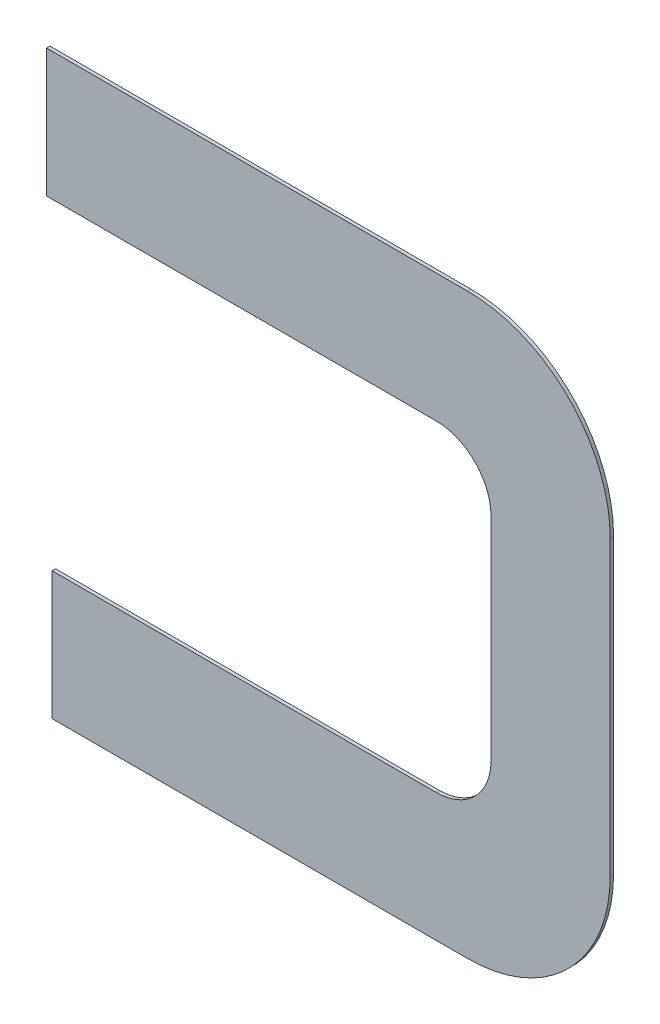
ISO-10303-21;
HEADER;
FILE_DESCRIPTION(('STEP AP214'),'2;1');
FILE_NAME('part.step','',(''),(''),'','','');
FILE_SCHEMA(('AUTOMOTIVE_DESIGN { 1 0 10303 214 1 1 1 1 }'));
ENDSEC;
DATA;
#1=APPLICATION_CONTEXT('core data for automotive mechanical design processes');
#2=APPLICATION_PROTOCOL_DEFINITION('international standard','automotive_design',2000,#1);
#3=PRODUCT_CONTEXT('',#1,'mechanical');
#4=PRODUCT('Part','Part','',(#3));
#5=PRODUCT_RELATED_PRODUCT_CATEGORY('part','',(#4));
#6=PRODUCT_DEFINITION_FORMATION('','',#4);
#7=PRODUCT_DEFINITION_CONTEXT('part definition',#1,'design');
#8=PRODUCT_DEFINITION('design','',#6,#7);
#9=PRODUCT_DEFINITION_SHAPE('','',#8);
#10=(LENGTH_UNIT() NAMED_UNIT(*) SI_UNIT(.MILLI.,.METRE.));
#11=(NAMED_UNIT(*) PLANE_ANGLE_UNIT() SI_UNIT($,.RADIAN.));
#12=(NAMED_UNIT(*) SI_UNIT($,.STERADIAN.) SOLID_ANGLE_UNIT());
#13=UNCERTAINTY_MEASURE_WITH_UNIT(LENGTH_MEASURE(1.E-05),#10,'distance_accuracy_value','');
#14=(GEOMETRIC_REPRESENTATION_CONTEXT(3) GLOBAL_UNCERTAINTY_ASSIGNED_CONTEXT((#13)) GLOBAL_UNIT_ASSIGNED_CONTEXT((#10,
#11,#12)) REPRESENTATION_CONTEXT('',''));
#15=CARTESIAN_POINT('',(0.,0.,0.));
#16=DIRECTION('',(0.,0.,1.));
#17=DIRECTION('',(1.,0.,0.));
#18=AXIS2_PLACEMENT_3D('',#15,#16,#17);
#19=CARTESIAN_POINT('',(2.205976284568,-14.65384962898,0.01));
#20=DIRECTION('',(0.,0.,1.));
#21=DIRECTION('',(1.,0.,0.));
#22=AXIS2_PLACEMENT_3D('',#19,#20,#21);
#23=PLANE('',#22);
#24=DIRECTION('',(-1.,0.,0.));
#25=VECTOR('',#24,1.);
#26=CARTESIAN_POINT('',(2.573938571429,-15.51474593191,0.01));
#27=LINE('',#26,#25);
#28=CARTESIAN_POINT('',(2.573938571429,-15.51474593191,0.01));
#29=VERTEX_POINT('',#28);
#30=CARTESIAN_POINT('',(1.340184000007,-15.51474593191,0.01));
#31=VERTEX_POINT('',#30);
#32=EDGE_CURVE('E435',#29,#31,#27,.T.);
#33=ORIENTED_EDGE('',*,*,#32,.F.);
#34=CARTESIAN_POINT('',(2.573938571429,-15.09141732865,0.01));
#35=DIRECTION('',(0.,0.,1.));
#36=DIRECTION('',(1.,0.,0.));
#37=AXIS2_PLACEMENT_3D('',#34,#35,#36);
#38=CIRCLE('',#37,0.423328603261);
#39=CARTESIAN_POINT('',(2.99726717469,-15.09141732865,0.01));
#40=VERTEX_POINT('',#39);
#41=EDGE_CURVE('E11',#29,#40,#38,.T.);
#42=ORIENTED_EDGE('',*,*,#41,.T.);
#43=DIRECTION('',(0.,-1.,0.));
#44=VECTOR('',#43,1.);
#45=CARTESIAN_POINT('',(2.99726717469,-14.22144689234,0.01));
#46=LINE('',#45,#44);
#47=CARTESIAN_POINT('',(2.99726717469,-14.22144689234,0.01));
#48=VERTEX_POINT('',#47);
#49=EDGE_CURVE('E165',#48,#40,#46,.T.);
#50=ORIENTED_EDGE('',*,*,#49,.F.);
#51=CARTESIAN_POINT('',(2.573938571429,-14.22144689234,0.01));
#52=DIRECTION('',(0.,0.,1.));
#53=DIRECTION('',(1.,0.,0.));
#54=AXIS2_PLACEMENT_3D('',#51,#52,#53);
#55=CIRCLE('',#54,0.423328603261);
#56=CARTESIAN_POINT('',(2.573938571429,-13.79811828908,0.01));
#57=VERTEX_POINT('',#56);
#58=EDGE_CURVE('E153',#48,#57,#55,.T.);
#59=ORIENTED_EDGE('',*,*,#58,.T.);
#60=DIRECTION('',(1.,0.,0.));
#61=VECTOR('',#60,1.);
#62=CARTESIAN_POINT('',(1.323052,-13.79811828908,0.01));
#63=LINE('',#62,#61);
#64=CARTESIAN_POINT('',(1.323052,-13.79811828908,0.01));
#65=VERTEX_POINT('',#64);
#66=EDGE_CURVE('E314',#65,#57,#63,.T.);
#67=ORIENTED_EDGE('',*,*,#66,.F.);
#68=DIRECTION('',(0.,1.,0.));
#69=VECTOR('',#68,1.);
#70=CARTESIAN_POINT('',(1.323052,-14.17865458836,0.01));
#71=LINE('',#70,#69);
#72=CARTESIAN_POINT('',(1.323052,-14.17865458836,0.01));
#73=VERTEX_POINT('',#72);
#74=EDGE_CURVE('E317',#73,#65,#71,.T.);
#75=ORIENTED_EDGE('',*,*,#74,.F.);
#76=DIRECTION('',(-1.,0.,0.));
#77=VECTOR('',#76,1.);
#78=CARTESIAN_POINT('',(2.480024778252,-14.17865458836,0.01));
#79=LINE('',#78,#77);
#80=CARTESIAN_POINT('',(2.480024778252,-14.17865458836,0.01));
#81=VERTEX_POINT('',#80);
#82=EDGE_CURVE('E359',#81,#73,#79,.T.);
#83=ORIENTED_EDGE('',*,*,#82,.F.);
#84=CARTESIAN_POINT('',(2.480024778252,-14.34205856215,0.01));
#85=DIRECTION('',(0.,0.,1.));
#86=DIRECTION('',(1.,0.,0.));
#87=AXIS2_PLACEMENT_3D('',#84,#85,#86);
#88=CIRCLE('',#87,0.16340397379);
#89=CARTESIAN_POINT('',(2.643428752042,-14.34205856215,0.01));
#90=VERTEX_POINT('',#89);
#91=EDGE_CURVE('E349',#90,#81,#88,.T.);
#92=ORIENTED_EDGE('',*,*,#91,.F.);
#93=DIRECTION('',(0.,1.,0.));
#94=VECTOR('',#93,1.);
#95=CARTESIAN_POINT('',(2.643428752042,-14.97080565884,0.01));
#96=LINE('',#95,#94);
#97=CARTESIAN_POINT('',(2.643428752042,-14.97080565884,0.01));
#98=VERTEX_POINT('',#97);
#99=EDGE_CURVE('E334',#98,#90,#96,.T.);
#100=ORIENTED_EDGE('',*,*,#99,.F.);
#101=CARTESIAN_POINT('',(2.480024778252,-14.97080565884,0.01));
#102=DIRECTION('',(0.,0.,1.));
#103=DIRECTION('',(1.,0.,0.));
#104=AXIS2_PLACEMENT_3D('',#101,#102,#103);
#105=CIRCLE('',#104,0.16340397379);
#106=CARTESIAN_POINT('',(2.480024778252,-15.13420963263,0.01));
#107=VERTEX_POINT('',#106);
#108=EDGE_CURVE('E344',#107,#98,#105,.T.);
#109=ORIENTED_EDGE('',*,*,#108,.F.);
#110=DIRECTION('',(1.,0.,0.));
#111=VECTOR('',#110,1.);
#112=CARTESIAN_POINT('',(1.340184000007,-15.13420963263,0.01));
#113=LINE('',#112,#111);
#114=CARTESIAN_POINT('',(1.340184000007,-15.13420963263,0.01));
#115=VERTEX_POINT('',#114);
#116=EDGE_CURVE('E394',#115,#107,#113,.T.);
#117=ORIENTED_EDGE('',*,*,#116,.F.);
#118=DIRECTION('',(0.,1.,0.));
#119=VECTOR('',#118,1.);
#120=CARTESIAN_POINT('',(1.340184000007,-15.51474593191,0.01));
#121=LINE('',#120,#119);
#122=EDGE_CURVE('E409',#31,#115,#121,.T.);
#123=ORIENTED_EDGE('',*,*,#122,.F.);
#124=EDGE_LOOP('',(#33,#42,#50,#59,#67,#75,#83,#92,#100,#109,#117,#123));
#125=FACE_BOUND('',#124,.T.);
#126=ADVANCED_FACE('F17',(#125),#23,.T.);
#127=CARTESIAN_POINT('',(2.205976284568,-14.65384962898,0.));
#128=DIRECTION('',(0.,0.,1.));
#129=DIRECTION('',(1.,0.,0.));
#130=AXIS2_PLACEMENT_3D('',#127,#128,#129);
#131=PLANE('',#130);
#132=DIRECTION('',(-1.,0.,0.));
#133=VECTOR('',#132,1.);
#134=CARTESIAN_POINT('',(2.573938571429,-15.51474593191,0.));
#135=LINE('',#134,#133);
#136=CARTESIAN_POINT('',(2.573938571429,-15.51474593191,0.));
#137=VERTEX_POINT('',#136);
#138=CARTESIAN_POINT('',(1.340184000007,-15.51474593191,0.));
#139=VERTEX_POINT('',#138);
#140=EDGE_CURVE('E416',#137,#139,#135,.T.);
#141=ORIENTED_EDGE('',*,*,#140,.T.);
#142=DIRECTION('',(0.,1.,0.));
#143=VECTOR('',#142,1.);
#144=CARTESIAN_POINT('',(1.340184000007,-15.51474593191,0.));
#145=LINE('',#144,#143);
#146=CARTESIAN_POINT('',(1.340184000007,-15.13420963263,0.));
#147=VERTEX_POINT('',#146);
#148=EDGE_CURVE('E398',#139,#147,#145,.T.);
#149=ORIENTED_EDGE('',*,*,#148,.T.);
#150=DIRECTION('',(1.,0.,0.));
#151=VECTOR('',#150,1.);
#152=CARTESIAN_POINT('',(1.340184000007,-15.13420963263,0.));
#153=LINE('',#152,#151);
#154=CARTESIAN_POINT('',(2.480024778252,-15.13420963263,0.));
#155=VERTEX_POINT('',#154);
#156=EDGE_CURVE('E340',#147,#155,#153,.T.);
#157=ORIENTED_EDGE('',*,*,#156,.T.);
#158=CARTESIAN_POINT('',(2.480024778252,-14.97080565884,0.));
#159=DIRECTION('',(0.,0.,1.));
#160=DIRECTION('',(1.,0.,0.));
#161=AXIS2_PLACEMENT_3D('',#158,#159,#160);
#162=CIRCLE('',#161,0.16340397379);
#163=CARTESIAN_POINT('',(2.643428752042,-14.97080565884,0.));
#164=VERTEX_POINT('',#163);
#165=EDGE_CURVE('E336',#155,#164,#162,.T.);
#166=ORIENTED_EDGE('',*,*,#165,.T.);
#167=DIRECTION('',(0.,1.,0.));
#168=VECTOR('',#167,1.);
#169=CARTESIAN_POINT('',(2.643428752042,-14.97080565884,0.));
#170=LINE('',#169,#168);
#171=CARTESIAN_POINT('',(2.643428752042,-14.34205856215,0.));
#172=VERTEX_POINT('',#171);
#173=EDGE_CURVE('E354',#164,#172,#170,.T.);
#174=ORIENTED_EDGE('',*,*,#173,.T.);
#175=CARTESIAN_POINT('',(2.480024778252,-14.34205856215,0.));
#176=DIRECTION('',(0.,0.,1.));
#177=DIRECTION('',(1.,0.,0.));
#178=AXIS2_PLACEMENT_3D('',#175,#176,#177);
#179=CIRCLE('',#178,0.16340397379);
#180=CARTESIAN_POINT('',(2.480024778252,-14.17865458836,0.));
#181=VERTEX_POINT('',#180);
#182=EDGE_CURVE('E355',#172,#181,#179,.T.);
#183=ORIENTED_EDGE('',*,*,#182,.T.);
#184=DIRECTION('',(-1.,0.,0.));
#185=VECTOR('',#184,1.);
#186=CARTESIAN_POINT('',(2.480024778252,-14.17865458836,0.));
#187=LINE('',#186,#185);
#188=CARTESIAN_POINT('',(1.323052,-14.17865458836,0.));
#189=VERTEX_POINT('',#188);
#190=EDGE_CURVE('E324',#181,#189,#187,.T.);
#191=ORIENTED_EDGE('',*,*,#190,.T.);
#192=DIRECTION('',(0.,1.,0.));
#193=VECTOR('',#192,1.);
#194=CARTESIAN_POINT('',(1.323052,-14.17865458836,0.));
#195=LINE('',#194,#193);
#196=CARTESIAN_POINT('',(1.323052,-13.79811828908,0.));
#197=VERTEX_POINT('',#196);
#198=EDGE_CURVE('E316',#189,#197,#195,.T.);
#199=ORIENTED_EDGE('',*,*,#198,.T.);
#200=DIRECTION('',(1.,0.,0.));
#201=VECTOR('',#200,1.);
#202=CARTESIAN_POINT('',(1.323052,-13.79811828908,0.));
#203=LINE('',#202,#201);
#204=CARTESIAN_POINT('',(2.573938571429,-13.79811828908,0.));
#205=VERTEX_POINT('',#204);
#206=EDGE_CURVE('E148',#197,#205,#203,.T.);
#207=ORIENTED_EDGE('',*,*,#206,.T.);
#208=CARTESIAN_POINT('',(2.573938571429,-14.22144689234,0.));
#209=DIRECTION('',(0.,0.,1.));
#210=DIRECTION('',(1.,0.,0.));
#211=AXIS2_PLACEMENT_3D('',#208,#209,#210);
#212=CIRCLE('',#211,0.423328603261);
#213=CARTESIAN_POINT('',(2.99726717469,-14.22144689234,0.));
#214=VERTEX_POINT('',#213);
#215=EDGE_CURVE('E144',#214,#205,#212,.T.);
#216=ORIENTED_EDGE('',*,*,#215,.F.);
#217=DIRECTION('',(0.,-1.,0.));
#218=VECTOR('',#217,1.);
#219=CARTESIAN_POINT('',(2.99726717469,-14.22144689234,0.));
#220=LINE('',#219,#218);
#221=CARTESIAN_POINT('',(2.99726717469,-15.09141732865,0.));
#222=VERTEX_POINT('',#221);
#223=EDGE_CURVE('E134',#214,#222,#220,.T.);
#224=ORIENTED_EDGE('',*,*,#223,.T.);
#225=CARTESIAN_POINT('',(2.573938571429,-15.09141732865,0.));
#226=DIRECTION('',(0.,0.,1.));
#227=DIRECTION('',(1.,0.,0.));
#228=AXIS2_PLACEMENT_3D('',#225,#226,#227);
#229=CIRCLE('',#228,0.423328603261);
#230=EDGE_CURVE('E26',#137,#222,#229,.T.);
#231=ORIENTED_EDGE('',*,*,#230,.F.);
#232=EDGE_LOOP('',(#141,#149,#157,#166,#174,#183,#191,#199,#207,#216,#224,#231));
#233=FACE_BOUND('',#232,.T.);
#234=ADVANCED_FACE('F146',(#233),#131,.F.);
#235=CARTESIAN_POINT('',(2.573938571429,-15.09141732865,0.));
#236=DIRECTION('',(0.,0.,-1.));
#237=DIRECTION('',(1.,0.,0.));
#238=AXIS2_PLACEMENT_3D('',#235,#236,#237);
#239=CYLINDRICAL_SURFACE('',#238,0.423328603261);
#240=DIRECTION('',(0.,0.,1.));
#241=VECTOR('',#240,1.);
#242=CARTESIAN_POINT('',(2.573938571429,-15.51474593191,0.));
#243=LINE('',#242,#241);
#244=EDGE_CURVE('E443',#137,#29,#243,.T.);
#245=ORIENTED_EDGE('',*,*,#244,.F.);
#246=ORIENTED_EDGE('',*,*,#230,.T.);
#247=DIRECTION('',(0.,0.,1.));
#248=VECTOR('',#247,1.);
#249=CARTESIAN_POINT('',(2.99726717469,-15.09141732865,0.));
#250=LINE('',#249,#248);
#251=EDGE_CURVE('E139',#222,#40,#250,.T.);
#252=ORIENTED_EDGE('',*,*,#251,.T.);
#253=ORIENTED_EDGE('',*,*,#41,.F.);
#254=EDGE_LOOP('',(#245,#246,#252,#253));
#255=FACE_BOUND('',#254,.T.);
#256=ADVANCED_FACE('F180',(#255),#239,.T.);
#257=CARTESIAN_POINT('',(2.99726717469,-14.22144689234,0.));
#258=DIRECTION('',(1.,0.,0.));
#259=DIRECTION('',(0.,1.,0.));
#260=AXIS2_PLACEMENT_3D('',#257,#258,#259);
#261=PLANE('',#260);
#262=DIRECTION('',(0.,0.,1.));
#263=VECTOR('',#262,1.);
#264=CARTESIAN_POINT('',(2.99726717469,-14.22144689234,0.));
#265=LINE('',#264,#263);
#266=EDGE_CURVE('E138',#214,#48,#265,.T.);
#267=ORIENTED_EDGE('',*,*,#266,.T.);
#268=ORIENTED_EDGE('',*,*,#49,.T.);
#269=ORIENTED_EDGE('',*,*,#251,.F.);
#270=ORIENTED_EDGE('',*,*,#223,.F.);
#271=EDGE_LOOP('',(#267,#268,#269,#270));
#272=FACE_BOUND('',#271,.T.);
#273=ADVANCED_FACE('F19',(#272),#261,.T.);
#274=CARTESIAN_POINT('',(2.573938571429,-14.22144689234,0.));
#275=DIRECTION('',(0.,0.,-1.));
#276=DIRECTION('',(1.,0.,0.));
#277=AXIS2_PLACEMENT_3D('',#274,#275,#276);
#278=CYLINDRICAL_SURFACE('',#277,0.423328603261);
#279=ORIENTED_EDGE('',*,*,#266,.F.);
#280=ORIENTED_EDGE('',*,*,#215,.T.);
#281=DIRECTION('',(0.,0.,1.));
#282=VECTOR('',#281,1.);
#283=CARTESIAN_POINT('',(2.573938571429,-13.79811828908,0.));
#284=LINE('',#283,#282);
#285=EDGE_CURVE('E161',#205,#57,#284,.T.);
#286=ORIENTED_EDGE('',*,*,#285,.T.);
#287=ORIENTED_EDGE('',*,*,#58,.F.);
#288=EDGE_LOOP('',(#279,#280,#286,#287));
#289=FACE_BOUND('',#288,.T.);
#290=ADVANCED_FACE('F156',(#289),#278,.T.);
#291=CARTESIAN_POINT('',(1.323052,-13.79811828908,0.));
#292=DIRECTION('',(0.,1.,0.));
#293=DIRECTION('',(1.,0.,0.));
#294=AXIS2_PLACEMENT_3D('',#291,#292,#293);
#295=PLANE('',#294);
#296=DIRECTION('',(0.,0.,1.));
#297=VECTOR('',#296,1.);
#298=CARTESIAN_POINT('',(1.323052,-13.79811828908,0.));
#299=LINE('',#298,#297);
#300=EDGE_CURVE('E312',#197,#65,#299,.T.);
#301=ORIENTED_EDGE('',*,*,#300,.T.);
#302=ORIENTED_EDGE('',*,*,#66,.T.);
#303=ORIENTED_EDGE('',*,*,#285,.F.);
#304=ORIENTED_EDGE('',*,*,#206,.F.);
#305=EDGE_LOOP('',(#301,#302,#303,#304));
#306=FACE_BOUND('',#305,.T.);
#307=ADVANCED_FACE('F211',(#306),#295,.T.);
#308=CARTESIAN_POINT('',(1.323052,-14.17865458836,0.));
#309=DIRECTION('',(-1.,0.,0.));
#310=DIRECTION('',(0.,0.,1.));
#311=AXIS2_PLACEMENT_3D('',#308,#309,#310);
#312=PLANE('',#311);
#313=DIRECTION('',(0.,0.,1.));
#314=VECTOR('',#313,1.);
#315=CARTESIAN_POINT('',(1.323052,-14.17865458836,0.));
#316=LINE('',#315,#314);
#317=EDGE_CURVE('E321',#189,#73,#316,.T.);
#318=ORIENTED_EDGE('',*,*,#317,.T.);
#319=ORIENTED_EDGE('',*,*,#74,.T.);
#320=ORIENTED_EDGE('',*,*,#300,.F.);
#321=ORIENTED_EDGE('',*,*,#198,.F.);
#322=EDGE_LOOP('',(#318,#319,#320,#321));
#323=FACE_BOUND('',#322,.T.);
#324=ADVANCED_FACE('F205',(#323),#312,.T.);
#325=CARTESIAN_POINT('',(2.480024778252,-14.17865458836,0.));
#326=DIRECTION('',(0.,-1.,0.));
#327=DIRECTION('',(0.,0.,-1.));
#328=AXIS2_PLACEMENT_3D('',#325,#326,#327);
#329=PLANE('',#328);
#330=DIRECTION('',(0.,0.,1.));
#331=VECTOR('',#330,1.);
#332=CARTESIAN_POINT('',(2.480024778252,-14.17865458836,0.));
#333=LINE('',#332,#331);
#334=EDGE_CURVE('E353',#181,#81,#333,.T.);
#335=ORIENTED_EDGE('',*,*,#334,.T.);
#336=ORIENTED_EDGE('',*,*,#82,.T.);
#337=ORIENTED_EDGE('',*,*,#317,.F.);
#338=ORIENTED_EDGE('',*,*,#190,.F.);
#339=EDGE_LOOP('',(#335,#336,#337,#338));
#340=FACE_BOUND('',#339,.T.);
#341=ADVANCED_FACE('F210',(#340),#329,.T.);
#342=CARTESIAN_POINT('',(2.480024778252,-14.34205856215,0.));
#343=DIRECTION('',(0.,0.,-1.));
#344=DIRECTION('',(1.,0.,0.));
#345=AXIS2_PLACEMENT_3D('',#342,#343,#344);
#346=CYLINDRICAL_SURFACE('',#345,0.16340397379);
#347=DIRECTION('',(0.,0.,1.));
#348=VECTOR('',#347,1.);
#349=CARTESIAN_POINT('',(2.643428752042,-14.34205856215,0.));
#350=LINE('',#349,#348);
#351=EDGE_CURVE('E387',#172,#90,#350,.T.);
#352=ORIENTED_EDGE('',*,*,#351,.T.);
#353=ORIENTED_EDGE('',*,*,#91,.T.);
#354=ORIENTED_EDGE('',*,*,#334,.F.);
#355=ORIENTED_EDGE('',*,*,#182,.F.);
#356=EDGE_LOOP('',(#352,#353,#354,#355));
#357=FACE_BOUND('',#356,.T.);
#358=ADVANCED_FACE('F241',(#357),#346,.F.);
#359=CARTESIAN_POINT('',(2.643428752042,-14.97080565884,0.));
#360=DIRECTION('',(-1.,0.,0.));
#361=DIRECTION('',(0.,0.,1.));
#362=AXIS2_PLACEMENT_3D('',#359,#360,#361);
#363=PLANE('',#362);
#364=DIRECTION('',(0.,0.,1.));
#365=VECTOR('',#364,1.);
#366=CARTESIAN_POINT('',(2.643428752042,-14.97080565884,0.));
#367=LINE('',#366,#365);
#368=EDGE_CURVE('E339',#164,#98,#367,.T.);
#369=ORIENTED_EDGE('',*,*,#368,.T.);
#370=ORIENTED_EDGE('',*,*,#99,.T.);
#371=ORIENTED_EDGE('',*,*,#351,.F.);
#372=ORIENTED_EDGE('',*,*,#173,.F.);
#373=EDGE_LOOP('',(#369,#370,#371,#372));
#374=FACE_BOUND('',#373,.T.);
#375=ADVANCED_FACE('F236',(#374),#363,.T.);
#376=CARTESIAN_POINT('',(2.480024778252,-14.97080565884,0.));
#377=DIRECTION('',(0.,0.,-1.));
#378=DIRECTION('',(1.,0.,0.));
#379=AXIS2_PLACEMENT_3D('',#376,#377,#378);
#380=CYLINDRICAL_SURFACE('',#379,0.16340397379);
#381=DIRECTION('',(0.,0.,1.));
#382=VECTOR('',#381,1.);
#383=CARTESIAN_POINT('',(2.480024778252,-15.13420963263,0.));
#384=LINE('',#383,#382);
#385=EDGE_CURVE('E345',#155,#107,#384,.T.);
#386=ORIENTED_EDGE('',*,*,#385,.T.);
#387=ORIENTED_EDGE('',*,*,#108,.T.);
#388=ORIENTED_EDGE('',*,*,#368,.F.);
#389=ORIENTED_EDGE('',*,*,#165,.F.);
#390=EDGE_LOOP('',(#386,#387,#388,#389));
#391=FACE_BOUND('',#390,.T.);
#392=ADVANCED_FACE('F230',(#391),#380,.F.);
#393=CARTESIAN_POINT('',(1.340184000007,-15.13420963263,0.));
#394=DIRECTION('',(0.,1.,0.));
#395=DIRECTION('',(1.,0.,0.));
#396=AXIS2_PLACEMENT_3D('',#393,#394,#395);
#397=PLANE('',#396);
#398=DIRECTION('',(0.,0.,1.));
#399=VECTOR('',#398,1.);
#400=CARTESIAN_POINT('',(1.340184000007,-15.13420963263,0.));
#401=LINE('',#400,#399);
#402=EDGE_CURVE('E402',#147,#115,#401,.T.);
#403=ORIENTED_EDGE('',*,*,#402,.T.);
#404=ORIENTED_EDGE('',*,*,#116,.T.);
#405=ORIENTED_EDGE('',*,*,#385,.F.);
#406=ORIENTED_EDGE('',*,*,#156,.F.);
#407=EDGE_LOOP('',(#403,#404,#405,#406));
#408=FACE_BOUND('',#407,.T.);
#409=ADVANCED_FACE('F221',(#408),#397,.T.);
#410=CARTESIAN_POINT('',(1.340184000007,-15.51474593191,0.));
#411=DIRECTION('',(-1.,0.,0.));
#412=DIRECTION('',(0.,0.,1.));
#413=AXIS2_PLACEMENT_3D('',#410,#411,#412);
#414=PLANE('',#413);
#415=DIRECTION('',(0.,0.,1.));
#416=VECTOR('',#415,1.);
#417=CARTESIAN_POINT('',(1.340184000007,-15.51474593191,0.));
#418=LINE('',#417,#416);
#419=EDGE_CURVE('E423',#139,#31,#418,.T.);
#420=ORIENTED_EDGE('',*,*,#419,.T.);
#421=ORIENTED_EDGE('',*,*,#122,.T.);
#422=ORIENTED_EDGE('',*,*,#402,.F.);
#423=ORIENTED_EDGE('',*,*,#148,.F.);
#424=EDGE_LOOP('',(#420,#421,#422,#423));
#425=FACE_BOUND('',#424,.T.);
#426=ADVANCED_FACE('F199',(#425),#414,.T.);
#427=CARTESIAN_POINT('',(2.573938571429,-15.51474593191,0.));
#428=DIRECTION('',(0.,-1.,0.));
#429=DIRECTION('',(0.,0.,-1.));
#430=AXIS2_PLACEMENT_3D('',#427,#428,#429);
#431=PLANE('',#430);
#432=ORIENTED_EDGE('',*,*,#244,.T.);
#433=ORIENTED_EDGE('',*,*,#32,.T.);
#434=ORIENTED_EDGE('',*,*,#419,.F.);
#435=ORIENTED_EDGE('',*,*,#140,.F.);
#436=EDGE_LOOP('',(#432,#433,#434,#435));
#437=FACE_BOUND('',#436,.T.);
#438=ADVANCED_FACE('F194',(#437),#431,.T.);
#439=CLOSED_SHELL('',(#126,#234,#256,#273,#290,#307,#324,#341,#358,#375,#392,#409,#426,#438));
#440=MANIFOLD_SOLID_BREP('B1',#439);
#441=ADVANCED_BREP_SHAPE_REPRESENTATION('',(#18,#440),#14);
#442=SHAPE_DEFINITION_REPRESENTATION(#9,#441);
ENDSEC;
END-ISO-10303-21;
